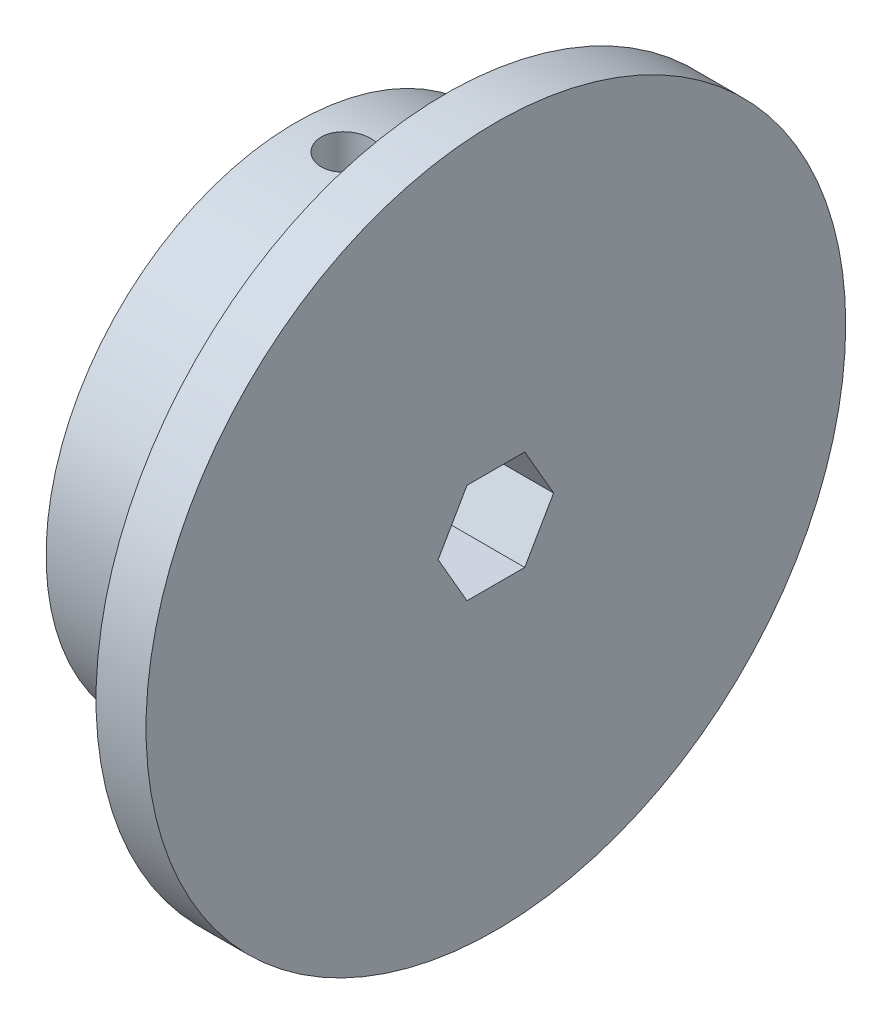
ISO-10303-21;
HEADER;
FILE_DESCRIPTION(('STEP AP214'),'2;1');
FILE_NAME('part.step','',(''),(''),'','','');
FILE_SCHEMA(('AUTOMOTIVE_DESIGN { 1 0 10303 214 1 1 1 1 }'));
ENDSEC;
DATA;
#1=APPLICATION_CONTEXT('core data for automotive mechanical design processes');
#2=APPLICATION_PROTOCOL_DEFINITION('international standard','automotive_design',2000,#1);
#3=PRODUCT_CONTEXT('',#1,'mechanical');
#4=PRODUCT('Part','Part','',(#3));
#5=PRODUCT_RELATED_PRODUCT_CATEGORY('part','',(#4));
#6=PRODUCT_DEFINITION_FORMATION('','',#4);
#7=PRODUCT_DEFINITION_CONTEXT('part definition',#1,'design');
#8=PRODUCT_DEFINITION('design','',#6,#7);
#9=PRODUCT_DEFINITION_SHAPE('','',#8);
#10=(LENGTH_UNIT() NAMED_UNIT(*) SI_UNIT(.MILLI.,.METRE.));
#11=(NAMED_UNIT(*) PLANE_ANGLE_UNIT() SI_UNIT($,.RADIAN.));
#12=(NAMED_UNIT(*) SI_UNIT($,.STERADIAN.) SOLID_ANGLE_UNIT());
#13=UNCERTAINTY_MEASURE_WITH_UNIT(LENGTH_MEASURE(1.E-05),#10,'distance_accuracy_value','');
#14=(GEOMETRIC_REPRESENTATION_CONTEXT(3) GLOBAL_UNCERTAINTY_ASSIGNED_CONTEXT((#13)) GLOBAL_UNIT_ASSIGNED_CONTEXT((#10,
#11,#12)) REPRESENTATION_CONTEXT('',''));
#15=CARTESIAN_POINT('',(0.,0.,0.));
#16=DIRECTION('',(0.,0.,1.));
#17=DIRECTION('',(1.,0.,0.));
#18=AXIS2_PLACEMENT_3D('',#15,#16,#17);
#19=CARTESIAN_POINT('',(6.35,0.,0.));
#20=DIRECTION('',(1.,0.,0.));
#21=DIRECTION('',(0.,0.,-1.));
#22=AXIS2_PLACEMENT_3D('',#19,#20,#21);
#23=PLANE('',#22);
#24=CARTESIAN_POINT('',(6.35,0.,0.));
#25=DIRECTION('',(1.,0.,0.));
#26=DIRECTION('',(0.,0.,-1.));
#27=AXIS2_PLACEMENT_3D('',#24,#25,#26);
#28=CIRCLE('',#27,44.45);
#29=CARTESIAN_POINT('',(6.35,0.,-44.45));
#30=VERTEX_POINT('',#29);
#31=EDGE_CURVE('E11',#30,#30,#28,.T.);
#32=ORIENTED_EDGE('',*,*,#31,.T.);
#33=EDGE_LOOP('',(#32));
#34=FACE_BOUND('',#33,.T.);
#35=DIRECTION('',(0.,0.866025403784438,-0.5));
#36=VECTOR('',#35,1.);
#37=CARTESIAN_POINT('',(6.35,-6.35,-3.66617420935412));
#38=LINE('',#37,#36);
#39=CARTESIAN_POINT('',(6.35,-6.35,-3.66617420935412));
#40=VERTEX_POINT('',#39);
#41=CARTESIAN_POINT('',(6.35,0.,-7.33234841870825));
#42=VERTEX_POINT('',#41);
#43=EDGE_CURVE('E154',#40,#42,#38,.T.);
#44=ORIENTED_EDGE('',*,*,#43,.F.);
#45=DIRECTION('',(0.,0.,-1.));
#46=VECTOR('',#45,1.);
#47=CARTESIAN_POINT('',(6.35,-6.35,3.66617420935412));
#48=LINE('',#47,#46);
#49=CARTESIAN_POINT('',(6.35,-6.35,3.66617420935412));
#50=VERTEX_POINT('',#49);
#51=EDGE_CURVE('E148',#50,#40,#48,.T.);
#52=ORIENTED_EDGE('',*,*,#51,.F.);
#53=DIRECTION('',(0.,-0.866025403784439,-0.5));
#54=VECTOR('',#53,1.);
#55=CARTESIAN_POINT('',(6.35,0.,7.33234841870825));
#56=LINE('',#55,#54);
#57=CARTESIAN_POINT('',(6.35,0.,7.33234841870825));
#58=VERTEX_POINT('',#57);
#59=EDGE_CURVE('E67',#58,#50,#56,.T.);
#60=ORIENTED_EDGE('',*,*,#59,.F.);
#61=DIRECTION('',(0.,-0.866025403784438,0.5));
#62=VECTOR('',#61,1.);
#63=CARTESIAN_POINT('',(6.35,6.35,3.66617420935413));
#64=LINE('',#63,#62);
#65=CARTESIAN_POINT('',(6.35,6.35,3.66617420935413));
#66=VERTEX_POINT('',#65);
#67=EDGE_CURVE('E104',#66,#58,#64,.T.);
#68=ORIENTED_EDGE('',*,*,#67,.F.);
#69=DIRECTION('',(0.,0.,1.));
#70=VECTOR('',#69,1.);
#71=CARTESIAN_POINT('',(6.35,6.35,-3.66617420935412));
#72=LINE('',#71,#70);
#73=CARTESIAN_POINT('',(6.35,6.35,-3.66617420935412));
#74=VERTEX_POINT('',#73);
#75=EDGE_CURVE('E160',#74,#66,#72,.T.);
#76=ORIENTED_EDGE('',*,*,#75,.F.);
#77=DIRECTION('',(0.,0.866025403784439,0.5));
#78=VECTOR('',#77,1.);
#79=CARTESIAN_POINT('',(6.35,0.,-7.33234841870825));
#80=LINE('',#79,#78);
#81=EDGE_CURVE('E157',#42,#74,#80,.T.);
#82=ORIENTED_EDGE('',*,*,#81,.F.);
#83=EDGE_LOOP('',(#44,#52,#60,#68,#76,#82));
#84=FACE_BOUND('',#83,.T.);
#85=ADVANCED_FACE('F39',(#34,#84),#23,.T.);
#86=CARTESIAN_POINT('',(0.,0.,0.));
#87=DIRECTION('',(1.,0.,0.));
#88=DIRECTION('',(0.,0.,-1.));
#89=AXIS2_PLACEMENT_3D('',#86,#87,#88);
#90=PLANE('',#89);
#91=CARTESIAN_POINT('',(0.,0.,0.));
#92=DIRECTION('',(1.,0.,0.));
#93=DIRECTION('',(0.,0.,-1.));
#94=AXIS2_PLACEMENT_3D('',#91,#92,#93);
#95=CIRCLE('',#94,31.75);
#96=CARTESIAN_POINT('',(0.,0.,-31.75));
#97=VERTEX_POINT('',#96);
#98=EDGE_CURVE('E143',#97,#97,#95,.T.);
#99=ORIENTED_EDGE('',*,*,#98,.T.);
#100=EDGE_LOOP('',(#99));
#101=FACE_BOUND('',#100,.T.);
#102=CARTESIAN_POINT('',(0.,0.,0.));
#103=DIRECTION('',(1.,0.,0.));
#104=DIRECTION('',(0.,0.,-1.));
#105=AXIS2_PLACEMENT_3D('',#102,#103,#104);
#106=CIRCLE('',#105,44.45);
#107=CARTESIAN_POINT('',(0.,0.,-44.45));
#108=VERTEX_POINT('',#107);
#109=EDGE_CURVE('E54',#108,#108,#106,.T.);
#110=ORIENTED_EDGE('',*,*,#109,.F.);
#111=EDGE_LOOP('',(#110));
#112=FACE_BOUND('',#111,.T.);
#113=ADVANCED_FACE('F204',(#101,#112),#90,.F.);
#114=CARTESIAN_POINT('',(6.35,0.,0.));
#115=DIRECTION('',(-1.,0.,0.));
#116=DIRECTION('',(0.,0.,1.));
#117=AXIS2_PLACEMENT_3D('',#114,#115,#116);
#118=CYLINDRICAL_SURFACE('',#117,44.45);
#119=ORIENTED_EDGE('',*,*,#31,.F.);
#120=EDGE_LOOP('',(#119));
#121=FACE_BOUND('',#120,.T.);
#122=ORIENTED_EDGE('',*,*,#109,.T.);
#123=EDGE_LOOP('',(#122));
#124=FACE_BOUND('',#123,.T.);
#125=ADVANCED_FACE('F41',(#121,#124),#118,.T.);
#126=CARTESIAN_POINT('',(6.35,-6.35,3.66617420935412));
#127=DIRECTION('',(0.,1.,0.));
#128=DIRECTION('',(0.,0.,1.));
#129=AXIS2_PLACEMENT_3D('',#126,#127,#128);
#130=PLANE('',#129);
#131=CARTESIAN_POINT('',(-12.7,-6.35,0.));
#132=DIRECTION('',(0.,1.,0.));
#133=DIRECTION('',(0.,0.,1.));
#134=AXIS2_PLACEMENT_3D('',#131,#132,#133);
#135=CIRCLE('',#134,3.1396229810612);
#136=CARTESIAN_POINT('',(-12.7,-6.35,3.1396229810612));
#137=VERTEX_POINT('',#136);
#138=EDGE_CURVE('E124',#137,#137,#135,.T.);
#139=ORIENTED_EDGE('',*,*,#138,.F.);
#140=EDGE_LOOP('',(#139));
#141=FACE_BOUND('',#140,.T.);
#142=DIRECTION('',(-1.,0.,0.));
#143=VECTOR('',#142,1.);
#144=CARTESIAN_POINT('',(6.35,-6.35,-3.66617420935412));
#145=LINE('',#144,#143);
#146=CARTESIAN_POINT('',(-19.05,-6.35,-3.66617420935413));
#147=VERTEX_POINT('',#146);
#148=EDGE_CURVE('E177',#40,#147,#145,.T.);
#149=ORIENTED_EDGE('',*,*,#148,.T.);
#150=DIRECTION('',(0.,0.,-1.));
#151=VECTOR('',#150,1.);
#152=CARTESIAN_POINT('',(-19.05,-6.35,3.66617420935412));
#153=LINE('',#152,#151);
#154=CARTESIAN_POINT('',(-19.05,-6.35,3.66617420935412));
#155=VERTEX_POINT('',#154);
#156=EDGE_CURVE('E116',#155,#147,#153,.T.);
#157=ORIENTED_EDGE('',*,*,#156,.F.);
#158=DIRECTION('',(-1.,0.,0.));
#159=VECTOR('',#158,1.);
#160=CARTESIAN_POINT('',(6.35,-6.35,3.66617420935412));
#161=LINE('',#160,#159);
#162=EDGE_CURVE('E107',#50,#155,#161,.T.);
#163=ORIENTED_EDGE('',*,*,#162,.F.);
#164=ORIENTED_EDGE('',*,*,#51,.T.);
#165=EDGE_LOOP('',(#149,#157,#163,#164));
#166=FACE_BOUND('',#165,.T.);
#167=ADVANCED_FACE('F213',(#141,#166),#130,.T.);
#168=CARTESIAN_POINT('',(6.35,-6.35,-3.66617420935412));
#169=DIRECTION('',(0.,0.5,0.866025403784438));
#170=DIRECTION('',(0.,-0.866025403784438,0.5));
#171=AXIS2_PLACEMENT_3D('',#168,#169,#170);
#172=PLANE('',#171);
#173=DIRECTION('',(-1.,0.,0.));
#174=VECTOR('',#173,1.);
#175=CARTESIAN_POINT('',(6.35,0.,-7.33234841870825));
#176=LINE('',#175,#174);
#177=CARTESIAN_POINT('',(-19.05,0.,-7.33234841870825));
#178=VERTEX_POINT('',#177);
#179=EDGE_CURVE('E174',#42,#178,#176,.T.);
#180=ORIENTED_EDGE('',*,*,#179,.T.);
#181=DIRECTION('',(0.,0.866025403784439,-0.5));
#182=VECTOR('',#181,1.);
#183=CARTESIAN_POINT('',(-19.05,-6.35,-3.66617420935413));
#184=LINE('',#183,#182);
#185=EDGE_CURVE('E134',#147,#178,#184,.T.);
#186=ORIENTED_EDGE('',*,*,#185,.F.);
#187=ORIENTED_EDGE('',*,*,#148,.F.);
#188=ORIENTED_EDGE('',*,*,#43,.T.);
#189=EDGE_LOOP('',(#180,#186,#187,#188));
#190=FACE_BOUND('',#189,.T.);
#191=ADVANCED_FACE('F216',(#190),#172,.T.);
#192=CARTESIAN_POINT('',(6.35,0.,-7.33234841870825));
#193=DIRECTION('',(0.,-0.5,0.866025403784439));
#194=DIRECTION('',(0.,-0.866025403784439,-0.5));
#195=AXIS2_PLACEMENT_3D('',#192,#193,#194);
#196=PLANE('',#195);
#197=DIRECTION('',(-1.,0.,0.));
#198=VECTOR('',#197,1.);
#199=CARTESIAN_POINT('',(6.35,6.35,-3.66617420935412));
#200=LINE('',#199,#198);
#201=CARTESIAN_POINT('',(-19.05,6.35,-3.66617420935412));
#202=VERTEX_POINT('',#201);
#203=EDGE_CURVE('E171',#74,#202,#200,.T.);
#204=ORIENTED_EDGE('',*,*,#203,.T.);
#205=DIRECTION('',(0.,0.866025403784439,0.5));
#206=VECTOR('',#205,1.);
#207=CARTESIAN_POINT('',(-19.05,0.,-7.33234841870825));
#208=LINE('',#207,#206);
#209=EDGE_CURVE('E138',#178,#202,#208,.T.);
#210=ORIENTED_EDGE('',*,*,#209,.F.);
#211=ORIENTED_EDGE('',*,*,#179,.F.);
#212=ORIENTED_EDGE('',*,*,#81,.T.);
#213=EDGE_LOOP('',(#204,#210,#211,#212));
#214=FACE_BOUND('',#213,.T.);
#215=ADVANCED_FACE('F220',(#214),#196,.T.);
#216=CARTESIAN_POINT('',(6.35,6.35,-3.66617420935412));
#217=DIRECTION('',(0.,-1.,0.));
#218=DIRECTION('',(0.,0.,-1.));
#219=AXIS2_PLACEMENT_3D('',#216,#217,#218);
#220=PLANE('',#219);
#221=CARTESIAN_POINT('',(-12.7,6.35,0.));
#222=DIRECTION('',(0.,-1.,0.));
#223=DIRECTION('',(0.,0.,-1.));
#224=AXIS2_PLACEMENT_3D('',#221,#222,#223);
#225=CIRCLE('',#224,3.1396229810612);
#226=CARTESIAN_POINT('',(-12.7,6.35,-3.1396229810612));
#227=VERTEX_POINT('',#226);
#228=EDGE_CURVE('E128',#227,#227,#225,.T.);
#229=ORIENTED_EDGE('',*,*,#228,.F.);
#230=EDGE_LOOP('',(#229));
#231=FACE_BOUND('',#230,.T.);
#232=DIRECTION('',(-1.,0.,0.));
#233=VECTOR('',#232,1.);
#234=CARTESIAN_POINT('',(6.35,6.35,3.66617420935413));
#235=LINE('',#234,#233);
#236=CARTESIAN_POINT('',(-19.05,6.35,3.66617420935412));
#237=VERTEX_POINT('',#236);
#238=EDGE_CURVE('E106',#66,#237,#235,.T.);
#239=ORIENTED_EDGE('',*,*,#238,.T.);
#240=DIRECTION('',(0.,0.,1.));
#241=VECTOR('',#240,1.);
#242=CARTESIAN_POINT('',(-19.05,6.35,-3.66617420935412));
#243=LINE('',#242,#241);
#244=EDGE_CURVE('E122',#202,#237,#243,.T.);
#245=ORIENTED_EDGE('',*,*,#244,.F.);
#246=ORIENTED_EDGE('',*,*,#203,.F.);
#247=ORIENTED_EDGE('',*,*,#75,.T.);
#248=EDGE_LOOP('',(#239,#245,#246,#247));
#249=FACE_BOUND('',#248,.T.);
#250=ADVANCED_FACE('F224',(#231,#249),#220,.T.);
#251=CARTESIAN_POINT('',(6.35,6.35,3.66617420935413));
#252=DIRECTION('',(0.,-0.5,-0.866025403784438));
#253=DIRECTION('',(0.,0.866025403784438,-0.5));
#254=AXIS2_PLACEMENT_3D('',#251,#252,#253);
#255=PLANE('',#254);
#256=DIRECTION('',(-1.,0.,0.));
#257=VECTOR('',#256,1.);
#258=CARTESIAN_POINT('',(6.35,0.,7.33234841870825));
#259=LINE('',#258,#257);
#260=CARTESIAN_POINT('',(-19.05,0.,7.33234841870825));
#261=VERTEX_POINT('',#260);
#262=EDGE_CURVE('E62',#58,#261,#259,.T.);
#263=ORIENTED_EDGE('',*,*,#262,.T.);
#264=DIRECTION('',(0.,-0.866025403784439,0.5));
#265=VECTOR('',#264,1.);
#266=CARTESIAN_POINT('',(-19.05,6.35,3.66617420935412));
#267=LINE('',#266,#265);
#268=EDGE_CURVE('E101',#237,#261,#267,.T.);
#269=ORIENTED_EDGE('',*,*,#268,.F.);
#270=ORIENTED_EDGE('',*,*,#238,.F.);
#271=ORIENTED_EDGE('',*,*,#67,.T.);
#272=EDGE_LOOP('',(#263,#269,#270,#271));
#273=FACE_BOUND('',#272,.T.);
#274=ADVANCED_FACE('F98',(#273),#255,.T.);
#275=CARTESIAN_POINT('',(6.35,0.,7.33234841870825));
#276=DIRECTION('',(0.,0.5,-0.866025403784439));
#277=DIRECTION('',(0.,0.866025403784439,0.5));
#278=AXIS2_PLACEMENT_3D('',#275,#276,#277);
#279=PLANE('',#278);
#280=ORIENTED_EDGE('',*,*,#162,.T.);
#281=DIRECTION('',(0.,-0.866025403784438,-0.5));
#282=VECTOR('',#281,1.);
#283=CARTESIAN_POINT('',(-19.05,0.,7.33234841870825));
#284=LINE('',#283,#282);
#285=EDGE_CURVE('E110',#261,#155,#284,.T.);
#286=ORIENTED_EDGE('',*,*,#285,.F.);
#287=ORIENTED_EDGE('',*,*,#262,.F.);
#288=ORIENTED_EDGE('',*,*,#59,.T.);
#289=EDGE_LOOP('',(#280,#286,#287,#288));
#290=FACE_BOUND('',#289,.T.);
#291=ADVANCED_FACE('F111',(#290),#279,.T.);
#292=CARTESIAN_POINT('',(-19.05,0.,0.));
#293=DIRECTION('',(1.,0.,0.));
#294=DIRECTION('',(0.,0.,-1.));
#295=AXIS2_PLACEMENT_3D('',#292,#293,#294);
#296=CYLINDRICAL_SURFACE('',#295,31.75);
#297=CARTESIAN_POINT('',(-12.7,-31.5943866459976,3.1396229810612));
#298=CARTESIAN_POINT('',(-12.8758908224589,-31.5943886867831,3.13961535701466));
#299=CARTESIAN_POINT('',(-13.0518981938686,-31.5958712903397,3.12479233031641));
#300=CARTESIAN_POINT('',(-13.3990337903104,-31.6016407492802,3.06588387881151));
#301=CARTESIAN_POINT('',(-13.5701564094375,-31.605930701307,3.02176613971222));
#302=CARTESIAN_POINT('',(-13.9024451403517,-31.6168242792331,2.90556485276426));
#303=CARTESIAN_POINT('',(-14.063617191937,-31.6234265088443,2.83349817929951));
#304=CARTESIAN_POINT('',(-14.3715424555621,-31.6381990176321,2.66347696761541));
#305=CARTESIAN_POINT('',(-14.5182985391482,-31.6463689835665,2.56552759942561));
#306=CARTESIAN_POINT('',(-14.7937833929519,-31.6633889909292,2.34614676955145));
#307=CARTESIAN_POINT('',(-14.9224536545219,-31.6722411023631,2.22464198979591));
#308=CARTESIAN_POINT('',(-15.1576106564747,-31.6896091872635,1.96175597240294));
#309=CARTESIAN_POINT('',(-15.2640963852383,-31.698125145387,1.82037382884576));
#310=CARTESIAN_POINT('',(-15.4520632620025,-31.7138817884021,1.52138866752155));
#311=CARTESIAN_POINT('',(-15.5334927123524,-31.7211198236714,1.3637529968054));
#312=CARTESIAN_POINT('',(-15.6687048126463,-31.7334825805188,1.03696225782535));
#313=CARTESIAN_POINT('',(-15.7224881226855,-31.7386073525539,0.867807464707824));
#314=CARTESIAN_POINT('',(-15.800709863588,-31.7461516357996,0.52337067377053));
#315=CARTESIAN_POINT('',(-15.8252442798804,-31.7485799939607,0.348110671129876));
#316=CARTESIAN_POINT('',(-15.8445687672244,-31.7504879188302,-0.00405514180605284));
#317=CARTESIAN_POINT('',(-15.8393595937013,-31.7499675604298,-0.180960910188381));
#318=CARTESIAN_POINT('',(-15.7994227322649,-31.7460439283589,-0.530745006166208));
#319=CARTESIAN_POINT('',(-15.7647982587387,-31.7426507352268,-0.703635247205358));
#320=CARTESIAN_POINT('',(-15.6671744310738,-31.7333743819933,-1.04113846941725));
#321=CARTESIAN_POINT('',(-15.604174715364,-31.7274911901634,-1.20575134508602));
#322=CARTESIAN_POINT('',(-15.4514754292367,-31.7138789777701,-1.52235264638583));
#323=CARTESIAN_POINT('',(-15.3617301449393,-31.7061468014056,-1.6743188826727));
#324=CARTESIAN_POINT('',(-15.1581204556289,-31.6897043273116,-1.96107101124517));
#325=CARTESIAN_POINT('',(-15.0442553590213,-31.6809940015386,-2.095856410722));
#326=CARTESIAN_POINT('',(-14.7950576905375,-31.6635288124732,-2.3450252649736));
#327=CARTESIAN_POINT('',(-14.6596353394054,-31.6547739180964,-2.45931894689887));
#328=CARTESIAN_POINT('',(-14.3714786976141,-31.6382435429597,-2.66356507511364));
#329=CARTESIAN_POINT('',(-14.2187443827464,-31.6304680635694,-2.75351748736451));
#330=CARTESIAN_POINT('',(-13.9002308199594,-31.616776116014,-2.9065270089878));
#331=CARTESIAN_POINT('',(-13.7344489213486,-31.61086002682,-2.96957863651892));
#332=CARTESIAN_POINT('',(-13.3945799300027,-31.6015644715779,-3.06692607102108));
#333=CARTESIAN_POINT('',(-13.2204930847305,-31.5981849299982,-3.10122273424073));
#334=CARTESIAN_POINT('',(-12.8697438121574,-31.5943581151463,-3.13997133680936));
#335=CARTESIAN_POINT('',(-12.6930953853838,-31.5938985053788,-3.14454883921136));
#336=CARTESIAN_POINT('',(-12.3415456596299,-31.5959310352273,-3.12405887597223));
#337=CARTESIAN_POINT('',(-12.1666443376056,-31.5984231358588,-3.09899180185963));
#338=CARTESIAN_POINT('',(-11.8239192279301,-31.6060670619673,-3.02002927299455));
#339=CARTESIAN_POINT('',(-11.6560816418087,-31.6112134142297,-2.96619313343618));
#340=CARTESIAN_POINT('',(-11.3318194886855,-31.6235815260696,-2.83128122154281));
#341=CARTESIAN_POINT('',(-11.1753951775919,-31.630803332165,-2.75020483865569));
#342=CARTESIAN_POINT('',(-10.8778274035442,-31.6465384954724,-2.56279912368949));
#343=CARTESIAN_POINT('',(-10.7367365906323,-31.6550560757717,-2.45638655254768));
#344=CARTESIAN_POINT('',(-10.4743746419806,-31.6724092080432,-2.22144849663446));
#345=CARTESIAN_POINT('',(-10.3531039862032,-31.6812447677093,-2.09292247652133));
#346=CARTESIAN_POINT('',(-10.1333920967552,-31.6982755089011,-1.81686133902378));
#347=CARTESIAN_POINT('',(-10.0350327509101,-31.7064683260581,-1.66926088248461));
#348=CARTESIAN_POINT('',(-9.86449892239814,-31.721256069283,-1.3595636485713));
#349=CARTESIAN_POINT('',(-9.79232408786573,-31.7278510168226,-1.19746706603148));
#350=CARTESIAN_POINT('',(-9.67634694645121,-31.7386892505907,-0.863665305359369));
#351=CARTESIAN_POINT('',(-9.63249509458677,-31.7429366414775,-0.691977479981298));
#352=CARTESIAN_POINT('',(-9.57424699949592,-31.7486180224194,-0.343631695204267));
#353=CARTESIAN_POINT('',(-9.55984994807303,-31.7500520896678,-0.166973872309579));
#354=CARTESIAN_POINT('',(-9.56093135346361,-31.7499452142227,0.185492697869805));
#355=CARTESIAN_POINT('',(-9.5762826513392,-31.748416934038,0.361301852977058));
#356=CARTESIAN_POINT('',(-9.63615845176701,-31.7425820756723,0.707830856420357));
#357=CARTESIAN_POINT('',(-9.68068297859485,-31.7382754951796,0.878550700521364));
#358=CARTESIAN_POINT('',(-9.79760632733058,-31.7273666089185,1.2100546496307));
#359=CARTESIAN_POINT('',(-9.87000153078536,-31.7207646011764,1.37084004128669));
#360=CARTESIAN_POINT('',(-10.0405975760831,-31.7060009818701,1.67799706280869));
#361=CARTESIAN_POINT('',(-10.1387982484801,-31.6978393805466,1.82436878731022));
#362=CARTESIAN_POINT('',(-10.3586945770421,-31.6808293244337,2.09919512620424));
#363=CARTESIAN_POINT('',(-10.480484883802,-31.6719781915089,2.22757384359968));
#364=CARTESIAN_POINT('',(-10.7439175931399,-31.6546093120322,2.46212925766133));
#365=CARTESIAN_POINT('',(-10.8855647557724,-31.6460916460467,2.56830061556104));
#366=CARTESIAN_POINT('',(-11.1850756059966,-31.6303313383153,2.75563538183334));
#367=CARTESIAN_POINT('',(-11.3429788511138,-31.6230919289983,2.83673576894299));
#368=CARTESIAN_POINT('',(-11.6701323278334,-31.6107463869917,2.97116331113111));
#369=CARTESIAN_POINT('',(-11.8393694974498,-31.605637846023,3.02452183660267));
#370=CARTESIAN_POINT('',(-12.1246398742134,-31.5994225961586,3.08862443718746));
#371=CARTESIAN_POINT('',(-12.2388484807512,-31.5975430274374,3.10772280630906));
#372=CARTESIAN_POINT('',(-12.4686879241887,-31.5950243837882,3.13322455946389));
#373=CARTESIAN_POINT('',(-12.5843187552826,-31.5943853037979,3.13962799530345));
#374=CARTESIAN_POINT('',(-12.7,-31.5943866459976,3.1396229810612));
#375=B_SPLINE_CURVE_WITH_KNOTS('',3,(#297,#298,#299,#300,#301,#302,#303,#304,#305,#306,#307,
#308,#309,#310,#311,#312,#313,#314,#315,#316,#317,#318,#319,#320,#321,#322,#323,#324,#325,#326,
#327,#328,#329,#330,#331,#332,#333,#334,#335,#336,#337,#338,#339,#340,#341,#342,#343,#344,#345,
#346,#347,#348,#349,#350,#351,#352,#353,#354,#355,#356,#357,#358,#359,#360,#361,#362,#363,#364,
#365,#366,#367,#368,#369,#370,#371,#372,#373,#374),.UNSPECIFIED.,.T.,.F.,(4,2,2,2,2,2,2,2,2,2,2,
2,2,2,2,2,2,2,2,2,2,2,2,2,2,2,2,2,2,2,2,2,2,2,2,2,2,2,4),(0.,0.527250025028928,1.05508261519374,
1.58259701725871,2.11000612865797,2.63908399220547,3.16818597653452,3.6983724276385,
4.22854621911945,4.75697531945065,5.2853909988448,5.8119601595673,6.3385360302822,
6.86601714439844,7.39351338518477,7.92326690545044,8.45302116651511,8.98288332938875,
9.51272971377434,10.0403360394667,10.5679353969156,11.0944511392434,11.6209786834757,
12.1492605400208,12.6775551874751,13.207710004651,13.7378576973834,14.2670754805981,
14.796278742659,15.3232249211316,15.8501715380869,16.3770497645623,16.9039245314928,
17.4329588328059,17.9621201709507,18.4926010519615,19.0224807552942,19.3692480693906,
19.7160139683726),.UNSPECIFIED.);
#376=CARTESIAN_POINT('',(-12.7,-31.5943866459976,3.1396229810612));
#377=VERTEX_POINT('',#376);
#378=EDGE_CURVE('E43',#377,#377,#375,.T.);
#379=ORIENTED_EDGE('',*,*,#378,.F.);
#380=EDGE_LOOP('',(#379));
#381=FACE_BOUND('',#380,.T.);
#382=CARTESIAN_POINT('',(-12.7,31.5943866459976,3.1396229810612));
#383=CARTESIAN_POINT('',(-12.5241091775411,31.5943886867832,3.13961535701466));
#384=CARTESIAN_POINT('',(-12.3481018061314,31.5958712903397,3.12479233031641));
#385=CARTESIAN_POINT('',(-12.0009662096896,31.6016407492802,3.06588387881151));
#386=CARTESIAN_POINT('',(-11.8298435905625,31.605930701307,3.02176613971222));
#387=CARTESIAN_POINT('',(-11.4975548596483,31.6168242792331,2.90556485276426));
#388=CARTESIAN_POINT('',(-11.336382808063,31.6234265088443,2.83349817929951));
#389=CARTESIAN_POINT('',(-11.0284575444379,31.6381990176321,2.66347696761541));
#390=CARTESIAN_POINT('',(-10.8817014608518,31.6463689835665,2.56552759942561));
#391=CARTESIAN_POINT('',(-10.6062166070481,31.6633889909292,2.34614676955145));
#392=CARTESIAN_POINT('',(-10.4775463454781,31.6722411023631,2.22464198979591));
#393=CARTESIAN_POINT('',(-10.2423893435253,31.6896091872635,1.96175597240294));
#394=CARTESIAN_POINT('',(-10.1359036147617,31.698125145387,1.82037382884576));
#395=CARTESIAN_POINT('',(-9.94793673799747,31.7138817884021,1.52138866752155));
#396=CARTESIAN_POINT('',(-9.86650728764759,31.7211198236714,1.36375299680539));
#397=CARTESIAN_POINT('',(-9.73129518735365,31.7334825805188,1.03696225782534));
#398=CARTESIAN_POINT('',(-9.67751187731454,31.7386073525539,0.86780746470782));
#399=CARTESIAN_POINT('',(-9.59929013641195,31.7461516357996,0.523370673770527));
#400=CARTESIAN_POINT('',(-9.57475572011963,31.7485799939607,0.348110671129873));
#401=CARTESIAN_POINT('',(-9.55543123277557,31.7504879188302,-0.00405514180605522));
#402=CARTESIAN_POINT('',(-9.5606404062987,31.7499675604298,-0.180960910188383));
#403=CARTESIAN_POINT('',(-9.6005772677351,31.7460439283589,-0.530745006166209));
#404=CARTESIAN_POINT('',(-9.63520174126131,31.7426507352268,-0.70363524720536));
#405=CARTESIAN_POINT('',(-9.73282556892616,31.7333743819933,-1.04113846941725));
#406=CARTESIAN_POINT('',(-9.79582528463605,31.7274911901634,-1.20575134508602));
#407=CARTESIAN_POINT('',(-9.94852457076332,31.7138789777701,-1.52235264638583));
#408=CARTESIAN_POINT('',(-10.0382698550607,31.7061468014056,-1.6743188826727));
#409=CARTESIAN_POINT('',(-10.2418795443711,31.6897043273116,-1.96107101124517));
#410=CARTESIAN_POINT('',(-10.3557446409787,31.6809940015386,-2.095856410722));
#411=CARTESIAN_POINT('',(-10.6049423094625,31.6635288124732,-2.3450252649736));
#412=CARTESIAN_POINT('',(-10.7403646605946,31.6547739180964,-2.45931894689887));
#413=CARTESIAN_POINT('',(-11.0285213023859,31.6382435429597,-2.66356507511364));
#414=CARTESIAN_POINT('',(-11.1812556172536,31.6304680635694,-2.75351748736451));
#415=CARTESIAN_POINT('',(-11.4997691800406,31.616776116014,-2.9065270089878));
#416=CARTESIAN_POINT('',(-11.6655510786514,31.61086002682,-2.96957863651892));
#417=CARTESIAN_POINT('',(-12.0054200699973,31.6015644715779,-3.06692607102108));
#418=CARTESIAN_POINT('',(-12.1795069152695,31.5981849299982,-3.10122273424073));
#419=CARTESIAN_POINT('',(-12.5302561878426,31.5943581151463,-3.13997133680936));
#420=CARTESIAN_POINT('',(-12.7069046146162,31.5938985053788,-3.14454883921136));
#421=CARTESIAN_POINT('',(-13.0584543403701,31.5959310352273,-3.12405887597223));
#422=CARTESIAN_POINT('',(-13.2333556623944,31.5984231358588,-3.09899180185963));
#423=CARTESIAN_POINT('',(-13.5760807720699,31.6060670619673,-3.02002927299455));
#424=CARTESIAN_POINT('',(-13.7439183581913,31.6112134142297,-2.96619313343618));
#425=CARTESIAN_POINT('',(-14.0681805113145,31.6235815260696,-2.83128122154281));
#426=CARTESIAN_POINT('',(-14.2246048224081,31.630803332165,-2.75020483865569));
#427=CARTESIAN_POINT('',(-14.5221725964558,31.6465384954724,-2.56279912368949));
#428=CARTESIAN_POINT('',(-14.6632634093677,31.6550560757717,-2.45638655254769));
#429=CARTESIAN_POINT('',(-14.9256253580194,31.6724092080432,-2.22144849663446));
#430=CARTESIAN_POINT('',(-15.0468960137968,31.6812447677093,-2.09292247652133));
#431=CARTESIAN_POINT('',(-15.2666079032448,31.6982755089011,-1.81686133902378));
#432=CARTESIAN_POINT('',(-15.3649672490899,31.706468326058,-1.66926088248461));
#433=CARTESIAN_POINT('',(-15.5355010776019,31.721256069283,-1.3595636485713));
#434=CARTESIAN_POINT('',(-15.6076759121343,31.7278510168226,-1.19746706603148));
#435=CARTESIAN_POINT('',(-15.7236530535488,31.7386892505907,-0.863665305359368));
#436=CARTESIAN_POINT('',(-15.7675049054132,31.7429366414775,-0.691977479981297));
#437=CARTESIAN_POINT('',(-15.8257530005041,31.7486180224194,-0.343631695204266));
#438=CARTESIAN_POINT('',(-15.840150051927,31.7500520896678,-0.166973872309579));
#439=CARTESIAN_POINT('',(-15.8390686465364,31.7499452142227,0.185492697869805));
#440=CARTESIAN_POINT('',(-15.8237173486608,31.748416934038,0.361301852977057));
#441=CARTESIAN_POINT('',(-15.763841548233,31.7425820756723,0.707830856420356));
#442=CARTESIAN_POINT('',(-15.7193170214051,31.7382754951796,0.878550700521364));
#443=CARTESIAN_POINT('',(-15.6023936726694,31.7273666089185,1.21005464963071));
#444=CARTESIAN_POINT('',(-15.5299984692146,31.7207646011764,1.3708400412867));
#445=CARTESIAN_POINT('',(-15.3594024239169,31.7060009818701,1.67799706280869));
#446=CARTESIAN_POINT('',(-15.2612017515199,31.6978393805466,1.82436878731023));
#447=CARTESIAN_POINT('',(-15.0413054229579,31.6808293244337,2.09919512620424));
#448=CARTESIAN_POINT('',(-14.919515116198,31.6719781915089,2.22757384359968));
#449=CARTESIAN_POINT('',(-14.6560824068601,31.6546093120322,2.46212925766133));
#450=CARTESIAN_POINT('',(-14.5144352442276,31.6460916460467,2.56830061556104));
#451=CARTESIAN_POINT('',(-14.2149243940034,31.6303313383153,2.75563538183334));
#452=CARTESIAN_POINT('',(-14.0570211488862,31.6230919289983,2.83673576894299));
#453=CARTESIAN_POINT('',(-13.7298676721666,31.6107463869917,2.97116331113111));
#454=CARTESIAN_POINT('',(-13.5606305025502,31.605637846023,3.02452183660267));
#455=CARTESIAN_POINT('',(-13.2753601257866,31.5994225961586,3.08862443718746));
#456=CARTESIAN_POINT('',(-13.1611515192488,31.5975430274374,3.10772280630906));
#457=CARTESIAN_POINT('',(-12.9313120758113,31.5950243837882,3.13322455946389));
#458=CARTESIAN_POINT('',(-12.8156812447174,31.5943853037979,3.13962799530345));
#459=CARTESIAN_POINT('',(-12.7,31.5943866459976,3.1396229810612));
#460=B_SPLINE_CURVE_WITH_KNOTS('',3,(#382,#383,#384,#385,#386,#387,#388,#389,#390,#391,#392,
#393,#394,#395,#396,#397,#398,#399,#400,#401,#402,#403,#404,#405,#406,#407,#408,#409,#410,#411,
#412,#413,#414,#415,#416,#417,#418,#419,#420,#421,#422,#423,#424,#425,#426,#427,#428,#429,#430,
#431,#432,#433,#434,#435,#436,#437,#438,#439,#440,#441,#442,#443,#444,#445,#446,#447,#448,#449,
#450,#451,#452,#453,#454,#455,#456,#457,#458,#459),.UNSPECIFIED.,.T.,.F.,(4,2,2,2,2,2,2,2,2,2,2,
2,2,2,2,2,2,2,2,2,2,2,2,2,2,2,2,2,2,2,2,2,2,2,2,2,2,2,4),(0.,0.52725002502893,1.05508261519374,
1.58259701725871,2.11000612865797,2.63908399220547,3.16818597653452,3.69837242763851,
4.22854621911946,4.75697531945065,5.2853909988448,5.81196015956731,6.3385360302822,
6.86601714439844,7.39351338518478,7.92326690545044,8.45302116651511,8.98288332938875,
9.51272971377434,10.0403360394667,10.5679353969156,11.0944511392434,11.6209786834757,
12.1492605400208,12.6775551874751,13.207710004651,13.7378576973834,14.2670754805981,
14.796278742659,15.3232249211316,15.8501715380869,16.3770497645623,16.9039245314928,
17.4329588328059,17.9621201709507,18.4926010519615,19.0224807552942,19.3692480693906,
19.7160139683726),.UNSPECIFIED.);
#461=CARTESIAN_POINT('',(-12.7,31.5943866459976,3.1396229810612));
#462=VERTEX_POINT('',#461);
#463=EDGE_CURVE('E182',#462,#462,#460,.T.);
#464=ORIENTED_EDGE('',*,*,#463,.F.);
#465=EDGE_LOOP('',(#464));
#466=FACE_BOUND('',#465,.T.);
#467=CARTESIAN_POINT('',(-19.05,0.,0.));
#468=DIRECTION('',(1.,0.,0.));
#469=DIRECTION('',(0.,0.,-1.));
#470=AXIS2_PLACEMENT_3D('',#467,#468,#469);
#471=CIRCLE('',#470,31.75);
#472=CARTESIAN_POINT('',(-19.05,0.,-31.75));
#473=VERTEX_POINT('',#472);
#474=EDGE_CURVE('E144',#473,#473,#471,.T.);
#475=ORIENTED_EDGE('',*,*,#474,.T.);
#476=EDGE_LOOP('',(#475));
#477=FACE_BOUND('',#476,.T.);
#478=ORIENTED_EDGE('',*,*,#98,.F.);
#479=EDGE_LOOP('',(#478));
#480=FACE_BOUND('',#479,.T.);
#481=ADVANCED_FACE('F188',(#381,#466,#477,#480),#296,.T.);
#482=CARTESIAN_POINT('',(-19.05,0.,0.));
#483=DIRECTION('',(1.,0.,0.));
#484=DIRECTION('',(0.,0.,-1.));
#485=AXIS2_PLACEMENT_3D('',#482,#483,#484);
#486=PLANE('',#485);
#487=ORIENTED_EDGE('',*,*,#244,.T.);
#488=ORIENTED_EDGE('',*,*,#268,.T.);
#489=ORIENTED_EDGE('',*,*,#285,.T.);
#490=ORIENTED_EDGE('',*,*,#156,.T.);
#491=ORIENTED_EDGE('',*,*,#185,.T.);
#492=ORIENTED_EDGE('',*,*,#209,.T.);
#493=EDGE_LOOP('',(#487,#488,#489,#490,#491,#492));
#494=FACE_BOUND('',#493,.T.);
#495=ORIENTED_EDGE('',*,*,#474,.F.);
#496=EDGE_LOOP('',(#495));
#497=FACE_BOUND('',#496,.T.);
#498=ADVANCED_FACE('F118',(#494,#497),#486,.F.);
#499=CARTESIAN_POINT('',(-12.7,-44.45,0.));
#500=DIRECTION('',(0.,1.,0.));
#501=DIRECTION('',(0.,0.,1.));
#502=AXIS2_PLACEMENT_3D('',#499,#500,#501);
#503=CYLINDRICAL_SURFACE('',#502,3.1396229810612);
#504=ORIENTED_EDGE('',*,*,#228,.T.);
#505=EDGE_LOOP('',(#504));
#506=FACE_BOUND('',#505,.T.);
#507=ORIENTED_EDGE('',*,*,#463,.T.);
#508=EDGE_LOOP('',(#507));
#509=FACE_BOUND('',#508,.T.);
#510=ADVANCED_FACE('F192',(#506,#509),#503,.F.);
#511=ORIENTED_EDGE('',*,*,#138,.T.);
#512=EDGE_LOOP('',(#511));
#513=FACE_BOUND('',#512,.T.);
#514=ORIENTED_EDGE('',*,*,#378,.T.);
#515=EDGE_LOOP('',(#514));
#516=FACE_BOUND('',#515,.T.);
#517=ADVANCED_FACE('F195',(#513,#516),#503,.F.);
#518=CLOSED_SHELL('',(#85,#113,#125,#167,#191,#215,#250,#274,#291,#481,#498,#510,#517));
#519=MANIFOLD_SOLID_BREP('B2',#518);
#520=ADVANCED_BREP_SHAPE_REPRESENTATION('',(#18,#519),#14);
#521=SHAPE_DEFINITION_REPRESENTATION(#9,#520);
ENDSEC;
END-ISO-10303-21;
